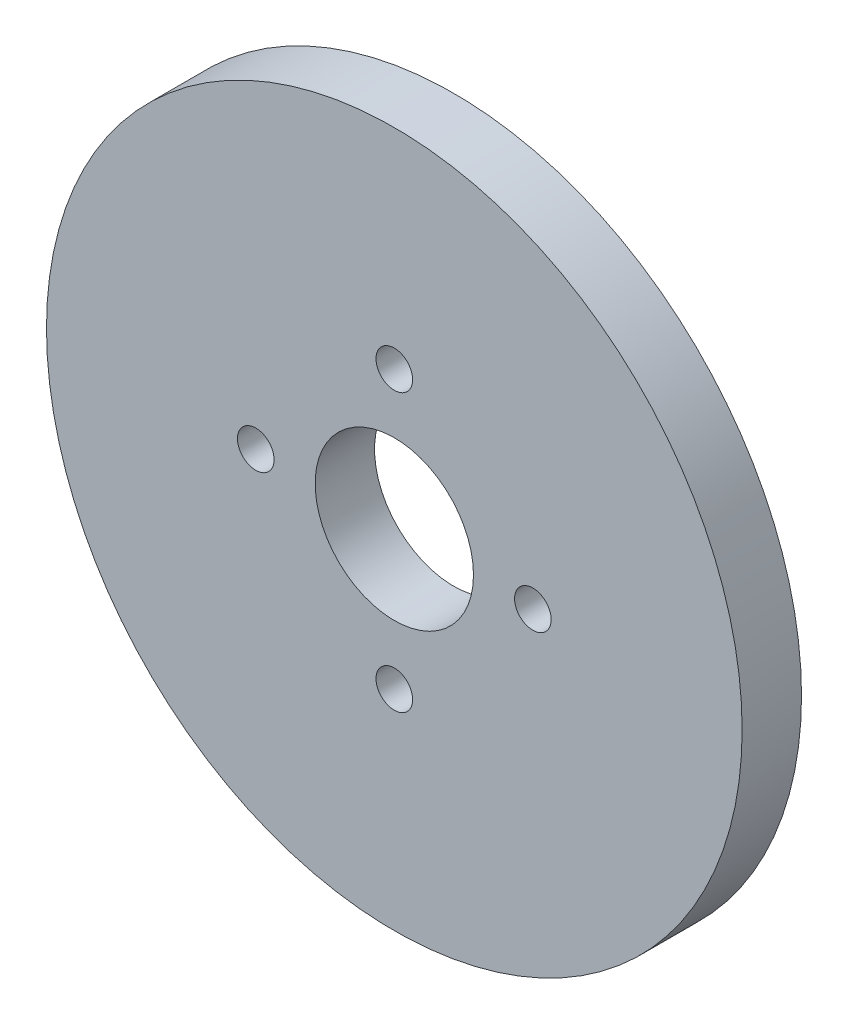
ISO-10303-21;
HEADER;
FILE_DESCRIPTION(('STEP AP214'),'2;1');
FILE_NAME('part.step','',(''),(''),'','','');
FILE_SCHEMA(('AUTOMOTIVE_DESIGN { 1 0 10303 214 1 1 1 1 }'));
ENDSEC;
DATA;
#1=APPLICATION_CONTEXT('core data for automotive mechanical design processes');
#2=APPLICATION_PROTOCOL_DEFINITION('international standard','automotive_design',2000,#1);
#3=PRODUCT_CONTEXT('',#1,'mechanical');
#4=PRODUCT('Part','Part','',(#3));
#5=PRODUCT_RELATED_PRODUCT_CATEGORY('part','',(#4));
#6=PRODUCT_DEFINITION_FORMATION('','',#4);
#7=PRODUCT_DEFINITION_CONTEXT('part definition',#1,'design');
#8=PRODUCT_DEFINITION('design','',#6,#7);
#9=PRODUCT_DEFINITION_SHAPE('','',#8);
#10=(LENGTH_UNIT() NAMED_UNIT(*) SI_UNIT(.MILLI.,.METRE.));
#11=(NAMED_UNIT(*) PLANE_ANGLE_UNIT() SI_UNIT($,.RADIAN.));
#12=(NAMED_UNIT(*) SI_UNIT($,.STERADIAN.) SOLID_ANGLE_UNIT());
#13=UNCERTAINTY_MEASURE_WITH_UNIT(LENGTH_MEASURE(1.E-05),#10,'distance_accuracy_value','');
#14=(GEOMETRIC_REPRESENTATION_CONTEXT(3) GLOBAL_UNCERTAINTY_ASSIGNED_CONTEXT((#13)) GLOBAL_UNIT_ASSIGNED_CONTEXT((#10,
#11,#12)) REPRESENTATION_CONTEXT('',''));
#15=CARTESIAN_POINT('',(0.,0.,0.));
#16=DIRECTION('',(0.,0.,1.));
#17=DIRECTION('',(1.,0.,0.));
#18=AXIS2_PLACEMENT_3D('',#15,#16,#17);
#19=CARTESIAN_POINT('',(0.,0.,3.));
#20=DIRECTION('',(0.,0.,1.));
#21=DIRECTION('',(1.,0.,0.));
#22=AXIS2_PLACEMENT_3D('',#19,#20,#21);
#23=PLANE('',#22);
#24=CARTESIAN_POINT('',(0.,7.,3.));
#25=DIRECTION('',(0.,0.,1.));
#26=DIRECTION('',(1.,0.,0.));
#27=AXIS2_PLACEMENT_3D('',#24,#25,#26);
#28=CIRCLE('',#27,0.925000000000065);
#29=CARTESIAN_POINT('',(0.925000000000065,7.,3.));
#30=VERTEX_POINT('',#29);
#31=EDGE_CURVE('E58',#30,#30,#28,.T.);
#32=ORIENTED_EDGE('',*,*,#31,.F.);
#33=EDGE_LOOP('',(#32));
#34=FACE_BOUND('',#33,.T.);
#35=CARTESIAN_POINT('',(3.9618942650685E-13,-7.,3.));
#36=DIRECTION('',(0.,0.,1.));
#37=DIRECTION('',(1.,0.,0.));
#38=AXIS2_PLACEMENT_3D('',#35,#36,#37);
#39=CIRCLE('',#38,0.92500000000049);
#40=CARTESIAN_POINT('',(0.925000000000886,-7.,3.));
#41=VERTEX_POINT('',#40);
#42=EDGE_CURVE('E46',#41,#41,#39,.T.);
#43=ORIENTED_EDGE('',*,*,#42,.F.);
#44=EDGE_LOOP('',(#43));
#45=FACE_BOUND('',#44,.T.);
#46=CARTESIAN_POINT('',(0.,0.,3.));
#47=DIRECTION('',(0.,0.,1.));
#48=DIRECTION('',(1.,0.,0.));
#49=AXIS2_PLACEMENT_3D('',#46,#47,#48);
#50=CIRCLE('',#49,17.575);
#51=CARTESIAN_POINT('',(17.575,0.,3.));
#52=VERTEX_POINT('',#51);
#53=EDGE_CURVE('E10',#52,#52,#50,.T.);
#54=ORIENTED_EDGE('',*,*,#53,.T.);
#55=EDGE_LOOP('',(#54));
#56=FACE_BOUND('',#55,.T.);
#57=CARTESIAN_POINT('',(7.,0.,3.));
#58=DIRECTION('',(0.,0.,1.));
#59=DIRECTION('',(1.,0.,0.));
#60=AXIS2_PLACEMENT_3D('',#57,#58,#59);
#61=CIRCLE('',#60,0.925000000000064);
#62=CARTESIAN_POINT('',(7.92500000000006,0.,3.));
#63=VERTEX_POINT('',#62);
#64=EDGE_CURVE('E41',#63,#63,#61,.T.);
#65=ORIENTED_EDGE('',*,*,#64,.F.);
#66=EDGE_LOOP('',(#65));
#67=FACE_BOUND('',#66,.T.);
#68=CARTESIAN_POINT('',(-7.,0.,3.));
#69=DIRECTION('',(0.,0.,1.));
#70=DIRECTION('',(1.,0.,0.));
#71=AXIS2_PLACEMENT_3D('',#68,#69,#70);
#72=CIRCLE('',#71,0.925000000000064);
#73=CARTESIAN_POINT('',(-6.07499999999994,0.,3.));
#74=VERTEX_POINT('',#73);
#75=EDGE_CURVE('E52',#74,#74,#72,.T.);
#76=ORIENTED_EDGE('',*,*,#75,.F.);
#77=EDGE_LOOP('',(#76));
#78=FACE_BOUND('',#77,.T.);
#79=CARTESIAN_POINT('',(0.,0.,3.));
#80=DIRECTION('',(0.,0.,1.));
#81=DIRECTION('',(1.,0.,0.));
#82=AXIS2_PLACEMENT_3D('',#79,#80,#81);
#83=CIRCLE('',#82,4.);
#84=CARTESIAN_POINT('',(4.,0.,3.));
#85=VERTEX_POINT('',#84);
#86=EDGE_CURVE('E64',#85,#85,#83,.T.);
#87=ORIENTED_EDGE('',*,*,#86,.F.);
#88=EDGE_LOOP('',(#87));
#89=FACE_BOUND('',#88,.T.);
#90=ADVANCED_FACE('F30',(#34,#45,#56,#67,#78,#89),#23,.T.);
#91=CARTESIAN_POINT('',(0.,0.,0.));
#92=DIRECTION('',(0.,0.,1.));
#93=DIRECTION('',(1.,0.,0.));
#94=AXIS2_PLACEMENT_3D('',#91,#92,#93);
#95=PLANE('',#94);
#96=CARTESIAN_POINT('',(0.,0.,0.));
#97=DIRECTION('',(0.,0.,1.));
#98=DIRECTION('',(1.,0.,0.));
#99=AXIS2_PLACEMENT_3D('',#96,#97,#98);
#100=CIRCLE('',#99,17.575);
#101=CARTESIAN_POINT('',(17.575,0.,0.));
#102=VERTEX_POINT('',#101);
#103=EDGE_CURVE('E34',#102,#102,#100,.T.);
#104=ORIENTED_EDGE('',*,*,#103,.F.);
#105=EDGE_LOOP('',(#104));
#106=FACE_BOUND('',#105,.T.);
#107=CARTESIAN_POINT('',(7.,0.,0.));
#108=DIRECTION('',(0.,0.,1.));
#109=DIRECTION('',(1.,0.,0.));
#110=AXIS2_PLACEMENT_3D('',#107,#108,#109);
#111=CIRCLE('',#110,0.925000000000064);
#112=CARTESIAN_POINT('',(7.92500000000006,0.,0.));
#113=VERTEX_POINT('',#112);
#114=EDGE_CURVE('E43',#113,#113,#111,.T.);
#115=ORIENTED_EDGE('',*,*,#114,.T.);
#116=EDGE_LOOP('',(#115));
#117=FACE_BOUND('',#116,.T.);
#118=CARTESIAN_POINT('',(3.9618942650685E-13,-7.,0.));
#119=DIRECTION('',(0.,0.,1.));
#120=DIRECTION('',(1.,0.,0.));
#121=AXIS2_PLACEMENT_3D('',#118,#119,#120);
#122=CIRCLE('',#121,0.92500000000049);
#123=CARTESIAN_POINT('',(0.925000000000886,-7.,0.));
#124=VERTEX_POINT('',#123);
#125=EDGE_CURVE('E49',#124,#124,#122,.T.);
#126=ORIENTED_EDGE('',*,*,#125,.T.);
#127=EDGE_LOOP('',(#126));
#128=FACE_BOUND('',#127,.T.);
#129=CARTESIAN_POINT('',(-7.,0.,0.));
#130=DIRECTION('',(0.,0.,1.));
#131=DIRECTION('',(1.,0.,0.));
#132=AXIS2_PLACEMENT_3D('',#129,#130,#131);
#133=CIRCLE('',#132,0.925000000000064);
#134=CARTESIAN_POINT('',(-6.07499999999994,0.,0.));
#135=VERTEX_POINT('',#134);
#136=EDGE_CURVE('E55',#135,#135,#133,.T.);
#137=ORIENTED_EDGE('',*,*,#136,.T.);
#138=EDGE_LOOP('',(#137));
#139=FACE_BOUND('',#138,.T.);
#140=CARTESIAN_POINT('',(0.,7.,0.));
#141=DIRECTION('',(0.,0.,1.));
#142=DIRECTION('',(1.,0.,0.));
#143=AXIS2_PLACEMENT_3D('',#140,#141,#142);
#144=CIRCLE('',#143,0.925000000000065);
#145=CARTESIAN_POINT('',(0.925000000000065,7.,0.));
#146=VERTEX_POINT('',#145);
#147=EDGE_CURVE('E61',#146,#146,#144,.T.);
#148=ORIENTED_EDGE('',*,*,#147,.T.);
#149=EDGE_LOOP('',(#148));
#150=FACE_BOUND('',#149,.T.);
#151=CARTESIAN_POINT('',(0.,0.,0.));
#152=DIRECTION('',(0.,0.,1.));
#153=DIRECTION('',(1.,0.,0.));
#154=AXIS2_PLACEMENT_3D('',#151,#152,#153);
#155=CIRCLE('',#154,4.);
#156=CARTESIAN_POINT('',(4.,0.,0.));
#157=VERTEX_POINT('',#156);
#158=EDGE_CURVE('E67',#157,#157,#155,.T.);
#159=ORIENTED_EDGE('',*,*,#158,.T.);
#160=EDGE_LOOP('',(#159));
#161=FACE_BOUND('',#160,.T.);
#162=ADVANCED_FACE('F77',(#106,#117,#128,#139,#150,#161),#95,.F.);
#163=CARTESIAN_POINT('',(0.,0.,3.));
#164=DIRECTION('',(0.,0.,-1.));
#165=DIRECTION('',(-1.,0.,0.));
#166=AXIS2_PLACEMENT_3D('',#163,#164,#165);
#167=CYLINDRICAL_SURFACE('',#166,17.575);
#168=ORIENTED_EDGE('',*,*,#53,.F.);
#169=EDGE_LOOP('',(#168));
#170=FACE_BOUND('',#169,.T.);
#171=ORIENTED_EDGE('',*,*,#103,.T.);
#172=EDGE_LOOP('',(#171));
#173=FACE_BOUND('',#172,.T.);
#174=ADVANCED_FACE('F32',(#170,#173),#167,.T.);
#175=CARTESIAN_POINT('',(7.,0.,3.));
#176=DIRECTION('',(0.,0.,-1.));
#177=DIRECTION('',(-1.,0.,0.));
#178=AXIS2_PLACEMENT_3D('',#175,#176,#177);
#179=CYLINDRICAL_SURFACE('',#178,0.925000000000064);
#180=ORIENTED_EDGE('',*,*,#64,.T.);
#181=EDGE_LOOP('',(#180));
#182=FACE_BOUND('',#181,.T.);
#183=ORIENTED_EDGE('',*,*,#114,.F.);
#184=EDGE_LOOP('',(#183));
#185=FACE_BOUND('',#184,.T.);
#186=ADVANCED_FACE('F87',(#182,#185),#179,.F.);
#187=CARTESIAN_POINT('',(3.9618942650685E-13,-7.,3.));
#188=DIRECTION('',(0.,0.,-1.));
#189=DIRECTION('',(-1.,0.,0.));
#190=AXIS2_PLACEMENT_3D('',#187,#188,#189);
#191=CYLINDRICAL_SURFACE('',#190,0.92500000000049);
#192=ORIENTED_EDGE('',*,*,#42,.T.);
#193=EDGE_LOOP('',(#192));
#194=FACE_BOUND('',#193,.T.);
#195=ORIENTED_EDGE('',*,*,#125,.F.);
#196=EDGE_LOOP('',(#195));
#197=FACE_BOUND('',#196,.T.);
#198=ADVANCED_FACE('F90',(#194,#197),#191,.F.);
#199=CARTESIAN_POINT('',(-7.,0.,3.));
#200=DIRECTION('',(0.,0.,-1.));
#201=DIRECTION('',(-1.,0.,0.));
#202=AXIS2_PLACEMENT_3D('',#199,#200,#201);
#203=CYLINDRICAL_SURFACE('',#202,0.925000000000064);
#204=ORIENTED_EDGE('',*,*,#75,.T.);
#205=EDGE_LOOP('',(#204));
#206=FACE_BOUND('',#205,.T.);
#207=ORIENTED_EDGE('',*,*,#136,.F.);
#208=EDGE_LOOP('',(#207));
#209=FACE_BOUND('',#208,.T.);
#210=ADVANCED_FACE('F94',(#206,#209),#203,.F.);
#211=CARTESIAN_POINT('',(0.,7.,3.));
#212=DIRECTION('',(0.,0.,-1.));
#213=DIRECTION('',(-1.,0.,0.));
#214=AXIS2_PLACEMENT_3D('',#211,#212,#213);
#215=CYLINDRICAL_SURFACE('',#214,0.925000000000065);
#216=ORIENTED_EDGE('',*,*,#31,.T.);
#217=EDGE_LOOP('',(#216));
#218=FACE_BOUND('',#217,.T.);
#219=ORIENTED_EDGE('',*,*,#147,.F.);
#220=EDGE_LOOP('',(#219));
#221=FACE_BOUND('',#220,.T.);
#222=ADVANCED_FACE('F98',(#218,#221),#215,.F.);
#223=CARTESIAN_POINT('',(0.,0.,3.));
#224=DIRECTION('',(0.,0.,-1.));
#225=DIRECTION('',(-1.,0.,0.));
#226=AXIS2_PLACEMENT_3D('',#223,#224,#225);
#227=CYLINDRICAL_SURFACE('',#226,4.);
#228=ORIENTED_EDGE('',*,*,#86,.T.);
#229=EDGE_LOOP('',(#228));
#230=FACE_BOUND('',#229,.T.);
#231=ORIENTED_EDGE('',*,*,#158,.F.);
#232=EDGE_LOOP('',(#231));
#233=FACE_BOUND('',#232,.T.);
#234=ADVANCED_FACE('F73',(#230,#233),#227,.F.);
#235=CLOSED_SHELL('',(#90,#162,#174,#186,#198,#210,#222,#234));
#236=MANIFOLD_SOLID_BREP('B2',#235);
#237=ADVANCED_BREP_SHAPE_REPRESENTATION('',(#18,#236),#14);
#238=SHAPE_DEFINITION_REPRESENTATION(#9,#237);
ENDSEC;
END-ISO-10303-21;
